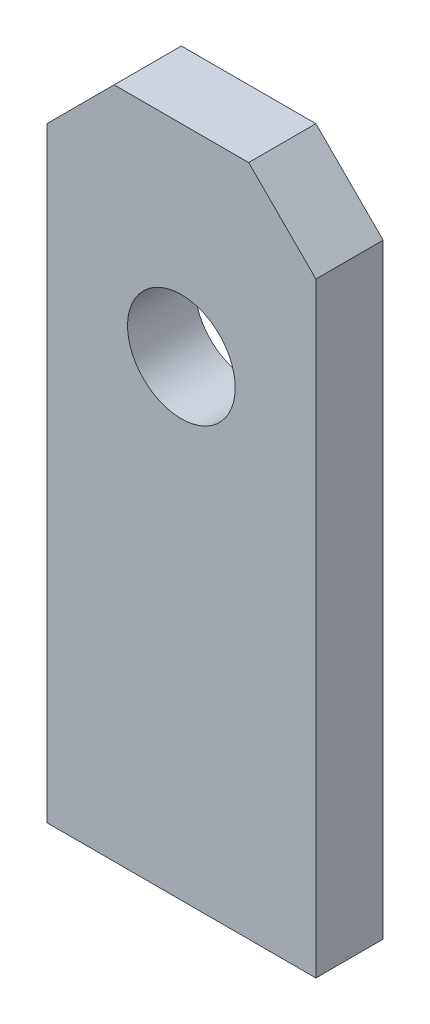
ISO-10303-21;
HEADER;
FILE_DESCRIPTION(('STEP AP214'),'2;1');
FILE_NAME('part.step','',(''),(''),'','','');
FILE_SCHEMA(('AUTOMOTIVE_DESIGN { 1 0 10303 214 1 1 1 1 }'));
ENDSEC;
DATA;
#1=APPLICATION_CONTEXT('core data for automotive mechanical design processes');
#2=APPLICATION_PROTOCOL_DEFINITION('international standard','automotive_design',2000,#1);
#3=PRODUCT_CONTEXT('',#1,'mechanical');
#4=PRODUCT('Part','Part','',(#3));
#5=PRODUCT_RELATED_PRODUCT_CATEGORY('part','',(#4));
#6=PRODUCT_DEFINITION_FORMATION('','',#4);
#7=PRODUCT_DEFINITION_CONTEXT('part definition',#1,'design');
#8=PRODUCT_DEFINITION('design','',#6,#7);
#9=PRODUCT_DEFINITION_SHAPE('','',#8);
#10=(LENGTH_UNIT() NAMED_UNIT(*) SI_UNIT(.MILLI.,.METRE.));
#11=(NAMED_UNIT(*) PLANE_ANGLE_UNIT() SI_UNIT($,.RADIAN.));
#12=(NAMED_UNIT(*) SI_UNIT($,.STERADIAN.) SOLID_ANGLE_UNIT());
#13=UNCERTAINTY_MEASURE_WITH_UNIT(LENGTH_MEASURE(1.E-05),#10,'distance_accuracy_value','');
#14=(GEOMETRIC_REPRESENTATION_CONTEXT(3) GLOBAL_UNCERTAINTY_ASSIGNED_CONTEXT((#13)) GLOBAL_UNIT_ASSIGNED_CONTEXT((#10,
#11,#12)) REPRESENTATION_CONTEXT('',''));
#15=CARTESIAN_POINT('',(0.,0.,0.));
#16=DIRECTION('',(0.,0.,1.));
#17=DIRECTION('',(1.,0.,0.));
#18=AXIS2_PLACEMENT_3D('',#15,#16,#17);
#19=CARTESIAN_POINT('',(0.,0.,5.));
#20=DIRECTION('',(0.,0.,1.));
#21=DIRECTION('',(1.,0.,0.));
#22=AXIS2_PLACEMENT_3D('',#19,#20,#21);
#23=PLANE('',#22);
#24=DIRECTION('',(0.,-1.,0.));
#25=VECTOR('',#24,1.);
#26=CARTESIAN_POINT('',(-20.,40.,5.));
#27=LINE('',#26,#25);
#28=CARTESIAN_POINT('',(-20.,40.,5.));
#29=VERTEX_POINT('',#28);
#30=CARTESIAN_POINT('',(-20.,-50.,5.));
#31=VERTEX_POINT('',#30);
#32=EDGE_CURVE('E131',#29,#31,#27,.T.);
#33=ORIENTED_EDGE('',*,*,#32,.T.);
#34=DIRECTION('',(1.,0.,0.));
#35=VECTOR('',#34,1.);
#36=CARTESIAN_POINT('',(-20.,-50.,5.));
#37=LINE('',#36,#35);
#38=CARTESIAN_POINT('',(20.,-50.,5.));
#39=VERTEX_POINT('',#38);
#40=EDGE_CURVE('E89',#31,#39,#37,.T.);
#41=ORIENTED_EDGE('',*,*,#40,.T.);
#42=DIRECTION('',(0.,1.,0.));
#43=VECTOR('',#42,1.);
#44=CARTESIAN_POINT('',(20.,-50.,5.));
#45=LINE('',#44,#43);
#46=CARTESIAN_POINT('',(20.,40.,5.));
#47=VERTEX_POINT('',#46);
#48=EDGE_CURVE('E102',#39,#47,#45,.T.);
#49=ORIENTED_EDGE('',*,*,#48,.T.);
#50=DIRECTION('',(-0.707106781186549,0.707106781186546,0.));
#51=VECTOR('',#50,1.);
#52=CARTESIAN_POINT('',(20.,40.,5.));
#53=LINE('',#52,#51);
#54=CARTESIAN_POINT('',(10.,50.,5.));
#55=VERTEX_POINT('',#54);
#56=EDGE_CURVE('E96',#47,#55,#53,.T.);
#57=ORIENTED_EDGE('',*,*,#56,.T.);
#58=DIRECTION('',(-1.,0.,0.));
#59=VECTOR('',#58,1.);
#60=CARTESIAN_POINT('',(10.,50.,5.));
#61=LINE('',#60,#59);
#62=CARTESIAN_POINT('',(-10.,50.,5.));
#63=VERTEX_POINT('',#62);
#64=EDGE_CURVE('E100',#55,#63,#61,.T.);
#65=ORIENTED_EDGE('',*,*,#64,.T.);
#66=DIRECTION('',(-0.707106781186549,-0.707106781186546,0.));
#67=VECTOR('',#66,1.);
#68=CARTESIAN_POINT('',(-10.,50.,5.));
#69=LINE('',#68,#67);
#70=EDGE_CURVE('E52',#63,#29,#69,.T.);
#71=ORIENTED_EDGE('',*,*,#70,.T.);
#72=EDGE_LOOP('',(#33,#41,#49,#57,#65,#71));
#73=FACE_BOUND('',#72,.T.);
#74=CARTESIAN_POINT('',(0.,20.,5.));
#75=DIRECTION('',(0.,0.,1.));
#76=DIRECTION('',(1.,0.,0.));
#77=AXIS2_PLACEMENT_3D('',#74,#75,#76);
#78=CIRCLE('',#77,8.);
#79=CARTESIAN_POINT('',(8.,20.,5.));
#80=VERTEX_POINT('',#79);
#81=EDGE_CURVE('E124',#80,#80,#78,.T.);
#82=ORIENTED_EDGE('',*,*,#81,.F.);
#83=EDGE_LOOP('',(#82));
#84=FACE_BOUND('',#83,.T.);
#85=ADVANCED_FACE('F35',(#73,#84),#23,.T.);
#86=CARTESIAN_POINT('',(0.,0.,-5.));
#87=DIRECTION('',(0.,0.,1.));
#88=DIRECTION('',(1.,0.,0.));
#89=AXIS2_PLACEMENT_3D('',#86,#87,#88);
#90=PLANE('',#89);
#91=DIRECTION('',(0.,-1.,0.));
#92=VECTOR('',#91,1.);
#93=CARTESIAN_POINT('',(-20.,40.,-5.));
#94=LINE('',#93,#92);
#95=CARTESIAN_POINT('',(-20.,40.,-5.));
#96=VERTEX_POINT('',#95);
#97=CARTESIAN_POINT('',(-20.,-50.,-5.));
#98=VERTEX_POINT('',#97);
#99=EDGE_CURVE('E120',#96,#98,#94,.T.);
#100=ORIENTED_EDGE('',*,*,#99,.F.);
#101=DIRECTION('',(-0.707106781186549,-0.707106781186546,0.));
#102=VECTOR('',#101,1.);
#103=CARTESIAN_POINT('',(-10.,50.,-5.));
#104=LINE('',#103,#102);
#105=CARTESIAN_POINT('',(-10.,50.,-5.));
#106=VERTEX_POINT('',#105);
#107=EDGE_CURVE('E81',#106,#96,#104,.T.);
#108=ORIENTED_EDGE('',*,*,#107,.F.);
#109=DIRECTION('',(-1.,0.,0.));
#110=VECTOR('',#109,1.);
#111=CARTESIAN_POINT('',(10.,50.,-5.));
#112=LINE('',#111,#110);
#113=CARTESIAN_POINT('',(10.,50.,-5.));
#114=VERTEX_POINT('',#113);
#115=EDGE_CURVE('E75',#114,#106,#112,.T.);
#116=ORIENTED_EDGE('',*,*,#115,.F.);
#117=DIRECTION('',(-0.707106781186549,0.707106781186546,0.));
#118=VECTOR('',#117,1.);
#119=CARTESIAN_POINT('',(20.,40.,-5.));
#120=LINE('',#119,#118);
#121=CARTESIAN_POINT('',(20.,40.,-5.));
#122=VERTEX_POINT('',#121);
#123=EDGE_CURVE('E110',#122,#114,#120,.T.);
#124=ORIENTED_EDGE('',*,*,#123,.F.);
#125=DIRECTION('',(0.,1.,0.));
#126=VECTOR('',#125,1.);
#127=CARTESIAN_POINT('',(20.,-50.,-5.));
#128=LINE('',#127,#126);
#129=CARTESIAN_POINT('',(20.,-50.,-5.));
#130=VERTEX_POINT('',#129);
#131=EDGE_CURVE('E126',#130,#122,#128,.T.);
#132=ORIENTED_EDGE('',*,*,#131,.F.);
#133=DIRECTION('',(1.,0.,0.));
#134=VECTOR('',#133,1.);
#135=CARTESIAN_POINT('',(-20.,-50.,-5.));
#136=LINE('',#135,#134);
#137=EDGE_CURVE('E123',#98,#130,#136,.T.);
#138=ORIENTED_EDGE('',*,*,#137,.F.);
#139=EDGE_LOOP('',(#100,#108,#116,#124,#132,#138));
#140=FACE_BOUND('',#139,.T.);
#141=CARTESIAN_POINT('',(0.,20.,-5.));
#142=DIRECTION('',(0.,0.,1.));
#143=DIRECTION('',(1.,0.,0.));
#144=AXIS2_PLACEMENT_3D('',#141,#142,#143);
#145=CIRCLE('',#144,8.);
#146=CARTESIAN_POINT('',(8.,20.,-5.));
#147=VERTEX_POINT('',#146);
#148=EDGE_CURVE('E224',#147,#147,#145,.T.);
#149=ORIENTED_EDGE('',*,*,#148,.T.);
#150=EDGE_LOOP('',(#149));
#151=FACE_BOUND('',#150,.T.);
#152=ADVANCED_FACE('F140',(#140,#151),#90,.F.);
#153=CARTESIAN_POINT('',(-20.,40.,5.));
#154=DIRECTION('',(1.,0.,0.));
#155=DIRECTION('',(0.,1.,0.));
#156=AXIS2_PLACEMENT_3D('',#153,#154,#155);
#157=PLANE('',#156);
#158=ORIENTED_EDGE('',*,*,#99,.T.);
#159=DIRECTION('',(0.,0.,-1.));
#160=VECTOR('',#159,1.);
#161=CARTESIAN_POINT('',(-20.,-50.,5.));
#162=LINE('',#161,#160);
#163=EDGE_CURVE('E11',#31,#98,#162,.T.);
#164=ORIENTED_EDGE('',*,*,#163,.F.);
#165=ORIENTED_EDGE('',*,*,#32,.F.);
#166=DIRECTION('',(0.,0.,-1.));
#167=VECTOR('',#166,1.);
#168=CARTESIAN_POINT('',(-20.,40.,5.));
#169=LINE('',#168,#167);
#170=EDGE_CURVE('E116',#29,#96,#169,.T.);
#171=ORIENTED_EDGE('',*,*,#170,.T.);
#172=EDGE_LOOP('',(#158,#164,#165,#171));
#173=FACE_BOUND('',#172,.T.);
#174=ADVANCED_FACE('F37',(#173),#157,.F.);
#175=CARTESIAN_POINT('',(-20.,-50.,5.));
#176=DIRECTION('',(0.,1.,0.));
#177=DIRECTION('',(0.,0.,1.));
#178=AXIS2_PLACEMENT_3D('',#175,#176,#177);
#179=PLANE('',#178);
#180=ORIENTED_EDGE('',*,*,#137,.T.);
#181=DIRECTION('',(0.,0.,-1.));
#182=VECTOR('',#181,1.);
#183=CARTESIAN_POINT('',(20.,-50.,5.));
#184=LINE('',#183,#182);
#185=EDGE_CURVE('E44',#39,#130,#184,.T.);
#186=ORIENTED_EDGE('',*,*,#185,.F.);
#187=ORIENTED_EDGE('',*,*,#40,.F.);
#188=ORIENTED_EDGE('',*,*,#163,.T.);
#189=EDGE_LOOP('',(#180,#186,#187,#188));
#190=FACE_BOUND('',#189,.T.);
#191=ADVANCED_FACE('F165',(#190),#179,.F.);
#192=CARTESIAN_POINT('',(20.,-50.,5.));
#193=DIRECTION('',(-1.,0.,0.));
#194=DIRECTION('',(0.,-1.,0.));
#195=AXIS2_PLACEMENT_3D('',#192,#193,#194);
#196=PLANE('',#195);
#197=ORIENTED_EDGE('',*,*,#131,.T.);
#198=DIRECTION('',(0.,0.,-1.));
#199=VECTOR('',#198,1.);
#200=CARTESIAN_POINT('',(20.,40.,5.));
#201=LINE('',#200,#199);
#202=EDGE_CURVE('E111',#47,#122,#201,.T.);
#203=ORIENTED_EDGE('',*,*,#202,.F.);
#204=ORIENTED_EDGE('',*,*,#48,.F.);
#205=ORIENTED_EDGE('',*,*,#185,.T.);
#206=EDGE_LOOP('',(#197,#203,#204,#205));
#207=FACE_BOUND('',#206,.T.);
#208=ADVANCED_FACE('F137',(#207),#196,.F.);
#209=CARTESIAN_POINT('',(20.,40.,5.));
#210=DIRECTION('',(-0.707106781186546,-0.707106781186549,0.));
#211=DIRECTION('',(0.707106781186549,-0.707106781186546,0.));
#212=AXIS2_PLACEMENT_3D('',#209,#210,#211);
#213=PLANE('',#212);
#214=ORIENTED_EDGE('',*,*,#123,.T.);
#215=DIRECTION('',(0.,0.,-1.));
#216=VECTOR('',#215,1.);
#217=CARTESIAN_POINT('',(10.,50.,5.));
#218=LINE('',#217,#216);
#219=EDGE_CURVE('E107',#55,#114,#218,.T.);
#220=ORIENTED_EDGE('',*,*,#219,.F.);
#221=ORIENTED_EDGE('',*,*,#56,.F.);
#222=ORIENTED_EDGE('',*,*,#202,.T.);
#223=EDGE_LOOP('',(#214,#220,#221,#222));
#224=FACE_BOUND('',#223,.T.);
#225=ADVANCED_FACE('F108',(#224),#213,.F.);
#226=CARTESIAN_POINT('',(10.,50.,5.));
#227=DIRECTION('',(0.,-1.,0.));
#228=DIRECTION('',(0.,0.,-1.));
#229=AXIS2_PLACEMENT_3D('',#226,#227,#228);
#230=PLANE('',#229);
#231=ORIENTED_EDGE('',*,*,#115,.T.);
#232=DIRECTION('',(0.,0.,-1.));
#233=VECTOR('',#232,1.);
#234=CARTESIAN_POINT('',(-10.,50.,5.));
#235=LINE('',#234,#233);
#236=EDGE_CURVE('E112',#63,#106,#235,.T.);
#237=ORIENTED_EDGE('',*,*,#236,.F.);
#238=ORIENTED_EDGE('',*,*,#64,.F.);
#239=ORIENTED_EDGE('',*,*,#219,.T.);
#240=EDGE_LOOP('',(#231,#237,#238,#239));
#241=FACE_BOUND('',#240,.T.);
#242=ADVANCED_FACE('F114',(#241),#230,.F.);
#243=CARTESIAN_POINT('',(-10.,50.,5.));
#244=DIRECTION('',(0.707106781186546,-0.707106781186549,0.));
#245=DIRECTION('',(0.707106781186549,0.707106781186546,0.));
#246=AXIS2_PLACEMENT_3D('',#243,#244,#245);
#247=PLANE('',#246);
#248=ORIENTED_EDGE('',*,*,#107,.T.);
#249=ORIENTED_EDGE('',*,*,#170,.F.);
#250=ORIENTED_EDGE('',*,*,#70,.F.);
#251=ORIENTED_EDGE('',*,*,#236,.T.);
#252=EDGE_LOOP('',(#248,#249,#250,#251));
#253=FACE_BOUND('',#252,.T.);
#254=ADVANCED_FACE('F145',(#253),#247,.F.);
#255=CARTESIAN_POINT('',(0.,20.,5.));
#256=DIRECTION('',(0.,0.,-1.));
#257=DIRECTION('',(-1.,0.,0.));
#258=AXIS2_PLACEMENT_3D('',#255,#256,#257);
#259=CYLINDRICAL_SURFACE('',#258,8.);
#260=ORIENTED_EDGE('',*,*,#81,.T.);
#261=EDGE_LOOP('',(#260));
#262=FACE_BOUND('',#261,.T.);
#263=ORIENTED_EDGE('',*,*,#148,.F.);
#264=EDGE_LOOP('',(#263));
#265=FACE_BOUND('',#264,.T.);
#266=ADVANCED_FACE('F147',(#262,#265),#259,.F.);
#267=CLOSED_SHELL('',(#85,#152,#174,#191,#208,#225,#242,#254,#266));
#268=MANIFOLD_SOLID_BREP('B2',#267);
#269=ADVANCED_BREP_SHAPE_REPRESENTATION('',(#18,#268),#14);
#270=SHAPE_DEFINITION_REPRESENTATION(#9,#269);
ENDSEC;
END-ISO-10303-21;
